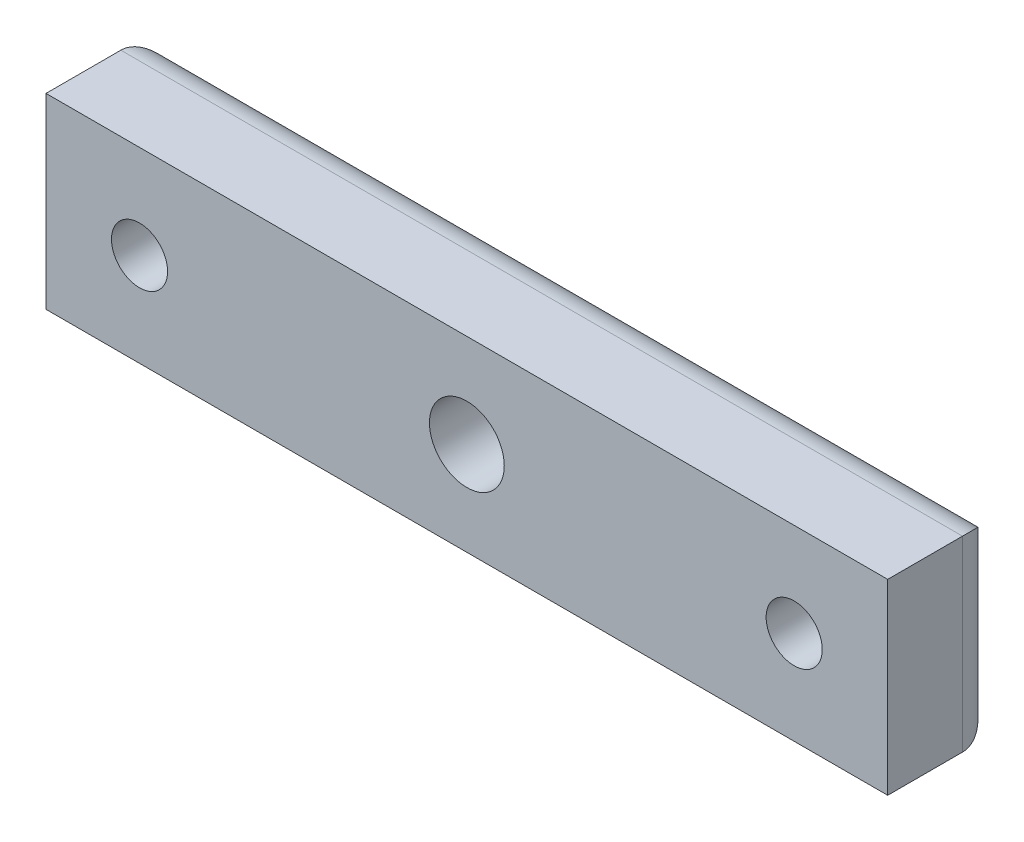
ISO-10303-21;
HEADER;
FILE_DESCRIPTION(('STEP AP214'),'2;1');
FILE_NAME('part.step','',(''),(''),'','','');
FILE_SCHEMA(('AUTOMOTIVE_DESIGN { 1 0 10303 214 1 1 1 1 }'));
ENDSEC;
DATA;
#1=APPLICATION_CONTEXT('core data for automotive mechanical design processes');
#2=APPLICATION_PROTOCOL_DEFINITION('international standard','automotive_design',2000,#1);
#3=PRODUCT_CONTEXT('',#1,'mechanical');
#4=PRODUCT('Part','Part','',(#3));
#5=PRODUCT_RELATED_PRODUCT_CATEGORY('part','',(#4));
#6=PRODUCT_DEFINITION_FORMATION('','',#4);
#7=PRODUCT_DEFINITION_CONTEXT('part definition',#1,'design');
#8=PRODUCT_DEFINITION('design','',#6,#7);
#9=PRODUCT_DEFINITION_SHAPE('','',#8);
#10=(LENGTH_UNIT() NAMED_UNIT(*) SI_UNIT(.MILLI.,.METRE.));
#11=(NAMED_UNIT(*) PLANE_ANGLE_UNIT() SI_UNIT($,.RADIAN.));
#12=(NAMED_UNIT(*) SI_UNIT($,.STERADIAN.) SOLID_ANGLE_UNIT());
#13=UNCERTAINTY_MEASURE_WITH_UNIT(LENGTH_MEASURE(1.E-05),#10,'distance_accuracy_value','');
#14=(GEOMETRIC_REPRESENTATION_CONTEXT(3) GLOBAL_UNCERTAINTY_ASSIGNED_CONTEXT((#13)) GLOBAL_UNIT_ASSIGNED_CONTEXT((#10,
#11,#12)) REPRESENTATION_CONTEXT('',''));
#15=CARTESIAN_POINT('',(0.,0.,0.));
#16=DIRECTION('',(0.,0.,1.));
#17=DIRECTION('',(1.,0.,0.));
#18=AXIS2_PLACEMENT_3D('',#15,#16,#17);
#19=CARTESIAN_POINT('',(43.,0.,2.));
#20=DIRECTION('',(0.,1.,0.));
#21=DIRECTION('',(0.,0.,1.));
#22=AXIS2_PLACEMENT_3D('',#19,#20,#21);
#23=CYLINDRICAL_SURFACE('',#22,2.);
#24=CARTESIAN_POINT('',(43.,2.,2.));
#25=DIRECTION('',(0.707106781186547,0.707106781186547,0.));
#26=DIRECTION('',(0.707106781186547,-0.707106781186547,0.));
#27=AXIS2_PLACEMENT_3D('',#24,#25,#26);
#28=ELLIPSE('',#27,2.82842712474619,2.);
#29=CARTESIAN_POINT('',(43.,2.,0.));
#30=VERTEX_POINT('',#29);
#31=CARTESIAN_POINT('',(45.,0.,2.));
#32=VERTEX_POINT('',#31);
#33=EDGE_CURVE('E11',#30,#32,#28,.F.);
#34=ORIENTED_EDGE('',*,*,#33,.F.);
#35=DIRECTION('',(0.,-1.,0.));
#36=VECTOR('',#35,1.);
#37=CARTESIAN_POINT('',(43.,0.,0.));
#38=LINE('',#37,#36);
#39=CARTESIAN_POINT('',(43.,8.,0.));
#40=VERTEX_POINT('',#39);
#41=EDGE_CURVE('E123',#40,#30,#38,.T.);
#42=ORIENTED_EDGE('',*,*,#41,.F.);
#43=CARTESIAN_POINT('',(43.,8.,2.));
#44=DIRECTION('',(-0.707106781186547,0.707106781186547,0.));
#45=DIRECTION('',(0.707106781186547,0.707106781186547,0.));
#46=AXIS2_PLACEMENT_3D('',#43,#44,#45);
#47=ELLIPSE('',#46,2.82842712474619,2.);
#48=CARTESIAN_POINT('',(45.,10.,2.));
#49=VERTEX_POINT('',#48);
#50=EDGE_CURVE('E47',#40,#49,#47,.F.);
#51=ORIENTED_EDGE('',*,*,#50,.T.);
#52=DIRECTION('',(0.,-1.,0.));
#53=VECTOR('',#52,1.);
#54=CARTESIAN_POINT('',(45.,0.,2.));
#55=LINE('',#54,#53);
#56=EDGE_CURVE('E153',#32,#49,#55,.F.);
#57=ORIENTED_EDGE('',*,*,#56,.F.);
#58=EDGE_LOOP('',(#34,#42,#51,#57));
#59=FACE_BOUND('',#58,.T.);
#60=ADVANCED_FACE('F39',(#59),#23,.T.);
#61=CARTESIAN_POINT('',(0.,8.,2.));
#62=DIRECTION('',(-1.,0.,0.));
#63=DIRECTION('',(0.,0.,1.));
#64=AXIS2_PLACEMENT_3D('',#61,#62,#63);
#65=CYLINDRICAL_SURFACE('',#64,2.);
#66=ORIENTED_EDGE('',*,*,#50,.F.);
#67=DIRECTION('',(1.,0.,0.));
#68=VECTOR('',#67,1.);
#69=CARTESIAN_POINT('',(0.,8.,0.));
#70=LINE('',#69,#68);
#71=CARTESIAN_POINT('',(2.,8.,0.));
#72=VERTEX_POINT('',#71);
#73=EDGE_CURVE('E128',#72,#40,#70,.T.);
#74=ORIENTED_EDGE('',*,*,#73,.F.);
#75=CARTESIAN_POINT('',(2.,8.,2.));
#76=DIRECTION('',(-0.707106781186547,-0.707106781186547,0.));
#77=DIRECTION('',(-0.707106781186547,0.707106781186547,0.));
#78=AXIS2_PLACEMENT_3D('',#75,#76,#77);
#79=ELLIPSE('',#78,2.82842712474619,2.);
#80=CARTESIAN_POINT('',(0.,10.,2.));
#81=VERTEX_POINT('',#80);
#82=EDGE_CURVE('E61',#72,#81,#79,.F.);
#83=ORIENTED_EDGE('',*,*,#82,.T.);
#84=DIRECTION('',(1.,0.,0.));
#85=VECTOR('',#84,1.);
#86=CARTESIAN_POINT('',(0.,10.,2.));
#87=LINE('',#86,#85);
#88=EDGE_CURVE('E150',#49,#81,#87,.F.);
#89=ORIENTED_EDGE('',*,*,#88,.F.);
#90=EDGE_LOOP('',(#66,#74,#83,#89));
#91=FACE_BOUND('',#90,.T.);
#92=ADVANCED_FACE('F184',(#91),#65,.T.);
#93=CARTESIAN_POINT('',(2.,0.,2.));
#94=DIRECTION('',(0.,-1.,0.));
#95=DIRECTION('',(0.,0.,-1.));
#96=AXIS2_PLACEMENT_3D('',#93,#94,#95);
#97=CYLINDRICAL_SURFACE('',#96,2.);
#98=ORIENTED_EDGE('',*,*,#82,.F.);
#99=DIRECTION('',(0.,1.,0.));
#100=VECTOR('',#99,1.);
#101=CARTESIAN_POINT('',(2.,0.,0.));
#102=LINE('',#101,#100);
#103=CARTESIAN_POINT('',(2.,2.,0.));
#104=VERTEX_POINT('',#103);
#105=EDGE_CURVE('E137',#104,#72,#102,.T.);
#106=ORIENTED_EDGE('',*,*,#105,.F.);
#107=CARTESIAN_POINT('',(2.,2.,2.));
#108=DIRECTION('',(0.707106781186547,-0.707106781186547,0.));
#109=DIRECTION('',(-0.707106781186547,-0.707106781186547,0.));
#110=AXIS2_PLACEMENT_3D('',#107,#108,#109);
#111=ELLIPSE('',#110,2.82842712474619,2.);
#112=CARTESIAN_POINT('',(0.,0.,2.));
#113=VERTEX_POINT('',#112);
#114=EDGE_CURVE('E156',#104,#113,#111,.F.);
#115=ORIENTED_EDGE('',*,*,#114,.T.);
#116=DIRECTION('',(0.,1.,0.));
#117=VECTOR('',#116,1.);
#118=CARTESIAN_POINT('',(0.,0.,2.));
#119=LINE('',#118,#117);
#120=EDGE_CURVE('E120',#81,#113,#119,.F.);
#121=ORIENTED_EDGE('',*,*,#120,.F.);
#122=EDGE_LOOP('',(#98,#106,#115,#121));
#123=FACE_BOUND('',#122,.T.);
#124=ADVANCED_FACE('F163',(#123),#97,.T.);
#125=CARTESIAN_POINT('',(0.,2.,2.));
#126=DIRECTION('',(1.,0.,0.));
#127=DIRECTION('',(0.,0.,-1.));
#128=AXIS2_PLACEMENT_3D('',#125,#126,#127);
#129=CYLINDRICAL_SURFACE('',#128,2.);
#130=DIRECTION('',(-1.,0.,0.));
#131=VECTOR('',#130,1.);
#132=CARTESIAN_POINT('',(0.,2.,0.));
#133=LINE('',#132,#131);
#134=EDGE_CURVE('E141',#30,#104,#133,.T.);
#135=ORIENTED_EDGE('',*,*,#134,.F.);
#136=ORIENTED_EDGE('',*,*,#33,.T.);
#137=DIRECTION('',(-1.,0.,0.));
#138=VECTOR('',#137,1.);
#139=CARTESIAN_POINT('',(0.,0.,2.));
#140=LINE('',#139,#138);
#141=EDGE_CURVE('E145',#113,#32,#140,.F.);
#142=ORIENTED_EDGE('',*,*,#141,.F.);
#143=ORIENTED_EDGE('',*,*,#114,.F.);
#144=EDGE_LOOP('',(#135,#136,#142,#143));
#145=FACE_BOUND('',#144,.T.);
#146=ADVANCED_FACE('F166',(#145),#129,.T.);
#147=CARTESIAN_POINT('',(0.,0.,6.));
#148=DIRECTION('',(0.,0.,-1.));
#149=DIRECTION('',(-1.,0.,0.));
#150=AXIS2_PLACEMENT_3D('',#147,#148,#149);
#151=PLANE('',#150);
#152=DIRECTION('',(0.,-1.,0.));
#153=VECTOR('',#152,1.);
#154=CARTESIAN_POINT('',(0.,0.,6.));
#155=LINE('',#154,#153);
#156=CARTESIAN_POINT('',(0.,10.,6.));
#157=VERTEX_POINT('',#156);
#158=CARTESIAN_POINT('',(0.,0.,6.));
#159=VERTEX_POINT('',#158);
#160=EDGE_CURVE('E104',#157,#159,#155,.T.);
#161=ORIENTED_EDGE('',*,*,#160,.T.);
#162=DIRECTION('',(1.,0.,0.));
#163=VECTOR('',#162,1.);
#164=CARTESIAN_POINT('',(0.,0.,6.));
#165=LINE('',#164,#163);
#166=CARTESIAN_POINT('',(45.,0.,6.));
#167=VERTEX_POINT('',#166);
#168=EDGE_CURVE('E92',#159,#167,#165,.T.);
#169=ORIENTED_EDGE('',*,*,#168,.T.);
#170=DIRECTION('',(0.,1.,0.));
#171=VECTOR('',#170,1.);
#172=CARTESIAN_POINT('',(45.,0.,6.));
#173=LINE('',#172,#171);
#174=CARTESIAN_POINT('',(45.,10.,6.));
#175=VERTEX_POINT('',#174);
#176=EDGE_CURVE('E103',#167,#175,#173,.T.);
#177=ORIENTED_EDGE('',*,*,#176,.T.);
#178=DIRECTION('',(-1.,0.,0.));
#179=VECTOR('',#178,1.);
#180=CARTESIAN_POINT('',(0.,10.,6.));
#181=LINE('',#180,#179);
#182=EDGE_CURVE('E110',#175,#157,#181,.T.);
#183=ORIENTED_EDGE('',*,*,#182,.T.);
#184=EDGE_LOOP('',(#161,#169,#177,#183));
#185=FACE_BOUND('',#184,.T.);
#186=CARTESIAN_POINT('',(5.,5.,6.));
#187=DIRECTION('',(0.,0.,1.));
#188=DIRECTION('',(1.,0.,0.));
#189=AXIS2_PLACEMENT_3D('',#186,#187,#188);
#190=CIRCLE('',#189,1.5);
#191=CARTESIAN_POINT('',(6.5,5.,6.));
#192=VERTEX_POINT('',#191);
#193=EDGE_CURVE('E115',#192,#192,#190,.T.);
#194=ORIENTED_EDGE('',*,*,#193,.F.);
#195=EDGE_LOOP('',(#194));
#196=FACE_BOUND('',#195,.T.);
#197=CARTESIAN_POINT('',(22.5,5.,6.));
#198=DIRECTION('',(0.,0.,1.));
#199=DIRECTION('',(1.,0.,0.));
#200=AXIS2_PLACEMENT_3D('',#197,#198,#199);
#201=CIRCLE('',#200,2.);
#202=CARTESIAN_POINT('',(24.5,5.,6.));
#203=VERTEX_POINT('',#202);
#204=EDGE_CURVE('E233',#203,#203,#201,.T.);
#205=ORIENTED_EDGE('',*,*,#204,.F.);
#206=EDGE_LOOP('',(#205));
#207=FACE_BOUND('',#206,.T.);
#208=CARTESIAN_POINT('',(40.,5.,6.));
#209=DIRECTION('',(0.,0.,1.));
#210=DIRECTION('',(1.,0.,0.));
#211=AXIS2_PLACEMENT_3D('',#208,#209,#210);
#212=CIRCLE('',#211,1.5);
#213=CARTESIAN_POINT('',(41.5,5.,6.));
#214=VERTEX_POINT('',#213);
#215=EDGE_CURVE('E222',#214,#214,#212,.T.);
#216=ORIENTED_EDGE('',*,*,#215,.F.);
#217=EDGE_LOOP('',(#216));
#218=FACE_BOUND('',#217,.T.);
#219=ADVANCED_FACE('F107',(#185,#196,#207,#218),#151,.F.);
#220=CARTESIAN_POINT('',(0.,0.,0.));
#221=DIRECTION('',(0.,0.,-1.));
#222=DIRECTION('',(-1.,0.,0.));
#223=AXIS2_PLACEMENT_3D('',#220,#221,#222);
#224=PLANE('',#223);
#225=ORIENTED_EDGE('',*,*,#41,.T.);
#226=ORIENTED_EDGE('',*,*,#134,.T.);
#227=ORIENTED_EDGE('',*,*,#105,.T.);
#228=ORIENTED_EDGE('',*,*,#73,.T.);
#229=EDGE_LOOP('',(#225,#226,#227,#228));
#230=FACE_BOUND('',#229,.T.);
#231=CARTESIAN_POINT('',(22.5,5.,0.));
#232=DIRECTION('',(0.,0.,1.));
#233=DIRECTION('',(1.,0.,0.));
#234=AXIS2_PLACEMENT_3D('',#231,#232,#233);
#235=CIRCLE('',#234,2.);
#236=CARTESIAN_POINT('',(24.5,5.,0.));
#237=VERTEX_POINT('',#236);
#238=EDGE_CURVE('E230',#237,#237,#235,.T.);
#239=ORIENTED_EDGE('',*,*,#238,.T.);
#240=EDGE_LOOP('',(#239));
#241=FACE_BOUND('',#240,.T.);
#242=CARTESIAN_POINT('',(5.,5.,0.));
#243=DIRECTION('',(0.,0.,1.));
#244=DIRECTION('',(1.,0.,0.));
#245=AXIS2_PLACEMENT_3D('',#242,#243,#244);
#246=CIRCLE('',#245,1.5);
#247=CARTESIAN_POINT('',(6.5,5.,0.));
#248=VERTEX_POINT('',#247);
#249=EDGE_CURVE('E237',#248,#248,#246,.T.);
#250=ORIENTED_EDGE('',*,*,#249,.T.);
#251=EDGE_LOOP('',(#250));
#252=FACE_BOUND('',#251,.T.);
#253=CARTESIAN_POINT('',(40.,5.,0.));
#254=DIRECTION('',(0.,0.,1.));
#255=DIRECTION('',(1.,0.,0.));
#256=AXIS2_PLACEMENT_3D('',#253,#254,#255);
#257=CIRCLE('',#256,1.5);
#258=CARTESIAN_POINT('',(41.5,5.,0.));
#259=VERTEX_POINT('',#258);
#260=EDGE_CURVE('E225',#259,#259,#257,.T.);
#261=ORIENTED_EDGE('',*,*,#260,.T.);
#262=EDGE_LOOP('',(#261));
#263=FACE_BOUND('',#262,.T.);
#264=ADVANCED_FACE('F168',(#230,#241,#252,#263),#224,.T.);
#265=CARTESIAN_POINT('',(0.,0.,6.));
#266=DIRECTION('',(1.,0.,0.));
#267=DIRECTION('',(0.,0.,-1.));
#268=AXIS2_PLACEMENT_3D('',#265,#266,#267);
#269=PLANE('',#268);
#270=DIRECTION('',(0.,0.,-1.));
#271=VECTOR('',#270,1.);
#272=CARTESIAN_POINT('',(0.,10.,6.));
#273=LINE('',#272,#271);
#274=EDGE_CURVE('E177',#157,#81,#273,.T.);
#275=ORIENTED_EDGE('',*,*,#274,.T.);
#276=ORIENTED_EDGE('',*,*,#120,.T.);
#277=DIRECTION('',(0.,0.,-1.));
#278=VECTOR('',#277,1.);
#279=CARTESIAN_POINT('',(0.,0.,6.));
#280=LINE('',#279,#278);
#281=EDGE_CURVE('E97',#159,#113,#280,.T.);
#282=ORIENTED_EDGE('',*,*,#281,.F.);
#283=ORIENTED_EDGE('',*,*,#160,.F.);
#284=EDGE_LOOP('',(#275,#276,#282,#283));
#285=FACE_BOUND('',#284,.T.);
#286=ADVANCED_FACE('F118',(#285),#269,.F.);
#287=CARTESIAN_POINT('',(0.,0.,6.));
#288=DIRECTION('',(0.,1.,0.));
#289=DIRECTION('',(0.,0.,1.));
#290=AXIS2_PLACEMENT_3D('',#287,#288,#289);
#291=PLANE('',#290);
#292=ORIENTED_EDGE('',*,*,#281,.T.);
#293=ORIENTED_EDGE('',*,*,#141,.T.);
#294=DIRECTION('',(0.,0.,-1.));
#295=VECTOR('',#294,1.);
#296=CARTESIAN_POINT('',(45.,0.,6.));
#297=LINE('',#296,#295);
#298=EDGE_CURVE('E99',#167,#32,#297,.T.);
#299=ORIENTED_EDGE('',*,*,#298,.F.);
#300=ORIENTED_EDGE('',*,*,#168,.F.);
#301=EDGE_LOOP('',(#292,#293,#299,#300));
#302=FACE_BOUND('',#301,.T.);
#303=ADVANCED_FACE('F94',(#302),#291,.F.);
#304=CARTESIAN_POINT('',(45.,0.,6.));
#305=DIRECTION('',(-1.,0.,0.));
#306=DIRECTION('',(0.,0.,1.));
#307=AXIS2_PLACEMENT_3D('',#304,#305,#306);
#308=PLANE('',#307);
#309=ORIENTED_EDGE('',*,*,#298,.T.);
#310=ORIENTED_EDGE('',*,*,#56,.T.);
#311=DIRECTION('',(0.,0.,-1.));
#312=VECTOR('',#311,1.);
#313=CARTESIAN_POINT('',(45.,10.,6.));
#314=LINE('',#313,#312);
#315=EDGE_CURVE('E130',#175,#49,#314,.T.);
#316=ORIENTED_EDGE('',*,*,#315,.F.);
#317=ORIENTED_EDGE('',*,*,#176,.F.);
#318=EDGE_LOOP('',(#309,#310,#316,#317));
#319=FACE_BOUND('',#318,.T.);
#320=ADVANCED_FACE('F172',(#319),#308,.F.);
#321=CARTESIAN_POINT('',(0.,10.,6.));
#322=DIRECTION('',(0.,-1.,0.));
#323=DIRECTION('',(0.,0.,-1.));
#324=AXIS2_PLACEMENT_3D('',#321,#322,#323);
#325=PLANE('',#324);
#326=ORIENTED_EDGE('',*,*,#315,.T.);
#327=ORIENTED_EDGE('',*,*,#88,.T.);
#328=ORIENTED_EDGE('',*,*,#274,.F.);
#329=ORIENTED_EDGE('',*,*,#182,.F.);
#330=EDGE_LOOP('',(#326,#327,#328,#329));
#331=FACE_BOUND('',#330,.T.);
#332=ADVANCED_FACE('F183',(#331),#325,.F.);
#333=CARTESIAN_POINT('',(5.,5.,6.));
#334=DIRECTION('',(0.,0.,-1.));
#335=DIRECTION('',(-1.,0.,0.));
#336=AXIS2_PLACEMENT_3D('',#333,#334,#335);
#337=CYLINDRICAL_SURFACE('',#336,1.5);
#338=ORIENTED_EDGE('',*,*,#193,.T.);
#339=EDGE_LOOP('',(#338));
#340=FACE_BOUND('',#339,.T.);
#341=ORIENTED_EDGE('',*,*,#249,.F.);
#342=EDGE_LOOP('',(#341));
#343=FACE_BOUND('',#342,.T.);
#344=ADVANCED_FACE('F202',(#340,#343),#337,.F.);
#345=CARTESIAN_POINT('',(22.5,5.,6.));
#346=DIRECTION('',(0.,0.,-1.));
#347=DIRECTION('',(-1.,0.,0.));
#348=AXIS2_PLACEMENT_3D('',#345,#346,#347);
#349=CYLINDRICAL_SURFACE('',#348,2.);
#350=ORIENTED_EDGE('',*,*,#204,.T.);
#351=EDGE_LOOP('',(#350));
#352=FACE_BOUND('',#351,.T.);
#353=ORIENTED_EDGE('',*,*,#238,.F.);
#354=EDGE_LOOP('',(#353));
#355=FACE_BOUND('',#354,.T.);
#356=ADVANCED_FACE('F209',(#352,#355),#349,.F.);
#357=CARTESIAN_POINT('',(40.,5.,6.));
#358=DIRECTION('',(0.,0.,-1.));
#359=DIRECTION('',(-1.,0.,0.));
#360=AXIS2_PLACEMENT_3D('',#357,#358,#359);
#361=CYLINDRICAL_SURFACE('',#360,1.5);
#362=ORIENTED_EDGE('',*,*,#215,.T.);
#363=EDGE_LOOP('',(#362));
#364=FACE_BOUND('',#363,.T.);
#365=ORIENTED_EDGE('',*,*,#260,.F.);
#366=EDGE_LOOP('',(#365));
#367=FACE_BOUND('',#366,.T.);
#368=ADVANCED_FACE('F213',(#364,#367),#361,.F.);
#369=CLOSED_SHELL('',(#60,#92,#124,#146,#219,#264,#286,#303,#320,#332,#344,#356,#368));
#370=MANIFOLD_SOLID_BREP('B2',#369);
#371=ADVANCED_BREP_SHAPE_REPRESENTATION('',(#18,#370),#14);
#372=SHAPE_DEFINITION_REPRESENTATION(#9,#371);
ENDSEC;
END-ISO-10303-21;
